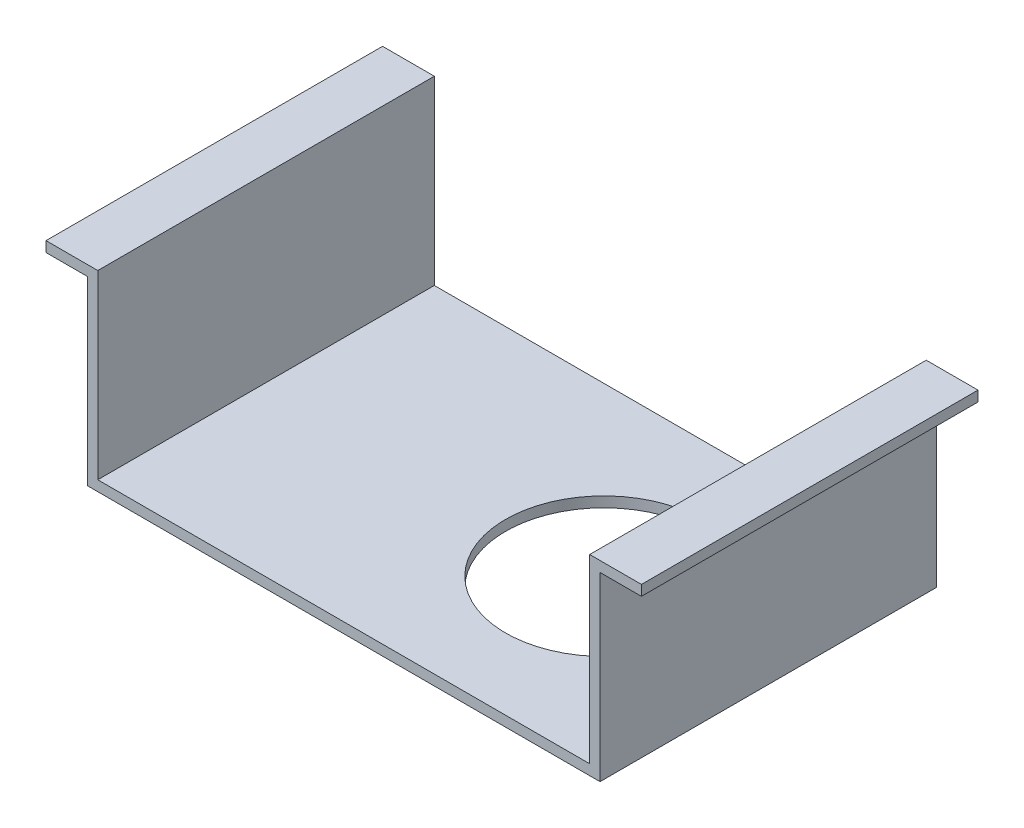
ISO-10303-21;
HEADER;
FILE_DESCRIPTION(('STEP AP214'),'2;1');
FILE_NAME('part.step','',(''),(''),'','','');
FILE_SCHEMA(('AUTOMOTIVE_DESIGN { 1 0 10303 214 1 1 1 1 }'));
ENDSEC;
DATA;
#1=APPLICATION_CONTEXT('core data for automotive mechanical design processes');
#2=APPLICATION_PROTOCOL_DEFINITION('international standard','automotive_design',2000,#1);
#3=PRODUCT_CONTEXT('',#1,'mechanical');
#4=PRODUCT('Part','Part','',(#3));
#5=PRODUCT_RELATED_PRODUCT_CATEGORY('part','',(#4));
#6=PRODUCT_DEFINITION_FORMATION('','',#4);
#7=PRODUCT_DEFINITION_CONTEXT('part definition',#1,'design');
#8=PRODUCT_DEFINITION('design','',#6,#7);
#9=PRODUCT_DEFINITION_SHAPE('','',#8);
#10=(LENGTH_UNIT() NAMED_UNIT(*) SI_UNIT(.MILLI.,.METRE.));
#11=(NAMED_UNIT(*) PLANE_ANGLE_UNIT() SI_UNIT($,.RADIAN.));
#12=(NAMED_UNIT(*) SI_UNIT($,.STERADIAN.) SOLID_ANGLE_UNIT());
#13=UNCERTAINTY_MEASURE_WITH_UNIT(LENGTH_MEASURE(1.E-05),#10,'distance_accuracy_value','');
#14=(GEOMETRIC_REPRESENTATION_CONTEXT(3) GLOBAL_UNCERTAINTY_ASSIGNED_CONTEXT((#13)) GLOBAL_UNIT_ASSIGNED_CONTEXT((#10,
#11,#12)) REPRESENTATION_CONTEXT('',''));
#15=CARTESIAN_POINT('',(0.,0.,0.));
#16=DIRECTION('',(0.,0.,1.));
#17=DIRECTION('',(1.,0.,0.));
#18=AXIS2_PLACEMENT_3D('',#15,#16,#17);
#19=CARTESIAN_POINT('',(-15.2277653266255,4.01234176298843,65.));
#20=DIRECTION('',(1.,0.,0.));
#21=DIRECTION('',(0.,0.,-1.));
#22=AXIS2_PLACEMENT_3D('',#19,#20,#21);
#23=PLANE('',#22);
#24=DIRECTION('',(0.,-1.,0.));
#25=VECTOR('',#24,1.);
#26=CARTESIAN_POINT('',(-15.2277653266255,4.01234176298843,0.));
#27=LINE('',#26,#25);
#28=CARTESIAN_POINT('',(-15.2277653266255,6.01234176298843,0.));
#29=VERTEX_POINT('',#28);
#30=CARTESIAN_POINT('',(-15.2277653266255,4.01234176298843,0.));
#31=VERTEX_POINT('',#30);
#32=EDGE_CURVE('E154',#29,#31,#27,.T.);
#33=ORIENTED_EDGE('',*,*,#32,.T.);
#34=DIRECTION('',(0.,0.,-1.));
#35=VECTOR('',#34,1.);
#36=CARTESIAN_POINT('',(-15.2277653266255,4.01234176298843,65.));
#37=LINE('',#36,#35);
#38=CARTESIAN_POINT('',(-15.2277653266255,4.01234176298843,65.));
#39=VERTEX_POINT('',#38);
#40=EDGE_CURVE('E11',#39,#31,#37,.T.);
#41=ORIENTED_EDGE('',*,*,#40,.F.);
#42=DIRECTION('',(0.,-1.,0.));
#43=VECTOR('',#42,1.);
#44=CARTESIAN_POINT('',(-15.2277653266255,4.01234176298843,65.));
#45=LINE('',#44,#43);
#46=CARTESIAN_POINT('',(-15.2277653266255,6.01234176298843,65.));
#47=VERTEX_POINT('',#46);
#48=EDGE_CURVE('E176',#47,#39,#45,.T.);
#49=ORIENTED_EDGE('',*,*,#48,.F.);
#50=DIRECTION('',(0.,0.,-1.));
#51=VECTOR('',#50,1.);
#52=CARTESIAN_POINT('',(-15.2277653266255,6.01234176298843,65.));
#53=LINE('',#52,#51);
#54=EDGE_CURVE('E150',#47,#29,#53,.T.);
#55=ORIENTED_EDGE('',*,*,#54,.T.);
#56=EDGE_LOOP('',(#33,#41,#49,#55));
#57=FACE_BOUND('',#56,.T.);
#58=ADVANCED_FACE('F33',(#57),#23,.F.);
#59=CARTESIAN_POINT('',(-7.2277653266255,4.01234176298844,65.));
#60=DIRECTION('',(0.,1.,0.));
#61=DIRECTION('',(-1.,0.,0.));
#62=AXIS2_PLACEMENT_3D('',#59,#60,#61);
#63=PLANE('',#62);
#64=DIRECTION('',(1.,0.,0.));
#65=VECTOR('',#64,1.);
#66=CARTESIAN_POINT('',(-7.2277653266255,4.01234176298844,0.));
#67=LINE('',#66,#65);
#68=CARTESIAN_POINT('',(-7.2277653266255,4.01234176298844,0.));
#69=VERTEX_POINT('',#68);
#70=EDGE_CURVE('E157',#31,#69,#67,.T.);
#71=ORIENTED_EDGE('',*,*,#70,.T.);
#72=DIRECTION('',(0.,0.,-1.));
#73=VECTOR('',#72,1.);
#74=CARTESIAN_POINT('',(-7.2277653266255,4.01234176298844,65.));
#75=LINE('',#74,#73);
#76=CARTESIAN_POINT('',(-7.2277653266255,4.01234176298844,65.));
#77=VERTEX_POINT('',#76);
#78=EDGE_CURVE('E42',#77,#69,#75,.T.);
#79=ORIENTED_EDGE('',*,*,#78,.F.);
#80=DIRECTION('',(1.,0.,0.));
#81=VECTOR('',#80,1.);
#82=CARTESIAN_POINT('',(-7.2277653266255,4.01234176298844,65.));
#83=LINE('',#82,#81);
#84=EDGE_CURVE('E105',#39,#77,#83,.T.);
#85=ORIENTED_EDGE('',*,*,#84,.F.);
#86=ORIENTED_EDGE('',*,*,#40,.T.);
#87=EDGE_LOOP('',(#71,#79,#85,#86));
#88=FACE_BOUND('',#87,.T.);
#89=ADVANCED_FACE('F255',(#88),#63,.F.);
#90=CARTESIAN_POINT('',(-7.2277653266255,-30.9876582370116,65.));
#91=DIRECTION('',(1.,0.,0.));
#92=DIRECTION('',(0.,1.,0.));
#93=AXIS2_PLACEMENT_3D('',#90,#91,#92);
#94=PLANE('',#93);
#95=DIRECTION('',(0.,-1.,0.));
#96=VECTOR('',#95,1.);
#97=CARTESIAN_POINT('',(-7.2277653266255,-30.9876582370116,0.));
#98=LINE('',#97,#96);
#99=CARTESIAN_POINT('',(-7.2277653266255,-30.9876582370116,0.));
#100=VERTEX_POINT('',#99);
#101=EDGE_CURVE('E159',#69,#100,#98,.T.);
#102=ORIENTED_EDGE('',*,*,#101,.T.);
#103=DIRECTION('',(0.,0.,-1.));
#104=VECTOR('',#103,1.);
#105=CARTESIAN_POINT('',(-7.2277653266255,-30.9876582370116,65.));
#106=LINE('',#105,#104);
#107=CARTESIAN_POINT('',(-7.2277653266255,-30.9876582370116,65.));
#108=VERTEX_POINT('',#107);
#109=EDGE_CURVE('E195',#108,#100,#106,.T.);
#110=ORIENTED_EDGE('',*,*,#109,.F.);
#111=DIRECTION('',(0.,-1.,0.));
#112=VECTOR('',#111,1.);
#113=CARTESIAN_POINT('',(-7.2277653266255,-30.9876582370116,65.));
#114=LINE('',#113,#112);
#115=EDGE_CURVE('E204',#77,#108,#114,.T.);
#116=ORIENTED_EDGE('',*,*,#115,.F.);
#117=ORIENTED_EDGE('',*,*,#78,.T.);
#118=EDGE_LOOP('',(#102,#110,#116,#117));
#119=FACE_BOUND('',#118,.T.);
#120=ADVANCED_FACE('F202',(#119),#94,.F.);
#121=CARTESIAN_POINT('',(91.7722346733745,-30.9876582370116,65.));
#122=DIRECTION('',(0.,1.,0.));
#123=DIRECTION('',(-1.,0.,0.));
#124=AXIS2_PLACEMENT_3D('',#121,#122,#123);
#125=PLANE('',#124);
#126=CARTESIAN_POINT('',(59.7722346733745,-30.9876582370116,32.2530530155588));
#127=DIRECTION('',(0.,-1.,0.));
#128=DIRECTION('',(1.,0.,0.));
#129=AXIS2_PLACEMENT_3D('',#126,#127,#128);
#130=CIRCLE('',#129,19.);
#131=CARTESIAN_POINT('',(78.7722346733745,-30.9876582370116,32.2530530155588));
#132=VERTEX_POINT('',#131);
#133=EDGE_CURVE('E288',#132,#132,#130,.T.);
#134=ORIENTED_EDGE('',*,*,#133,.F.);
#135=EDGE_LOOP('',(#134));
#136=FACE_BOUND('',#135,.T.);
#137=DIRECTION('',(1.,0.,0.));
#138=VECTOR('',#137,1.);
#139=CARTESIAN_POINT('',(91.7722346733745,-30.9876582370116,0.));
#140=LINE('',#139,#138);
#141=CARTESIAN_POINT('',(91.7722346733745,-30.9876582370116,0.));
#142=VERTEX_POINT('',#141);
#143=EDGE_CURVE('E161',#100,#142,#140,.T.);
#144=ORIENTED_EDGE('',*,*,#143,.T.);
#145=DIRECTION('',(0.,0.,-1.));
#146=VECTOR('',#145,1.);
#147=CARTESIAN_POINT('',(91.7722346733745,-30.9876582370116,65.));
#148=LINE('',#147,#146);
#149=CARTESIAN_POINT('',(91.7722346733745,-30.9876582370116,65.));
#150=VERTEX_POINT('',#149);
#151=EDGE_CURVE('E192',#150,#142,#148,.T.);
#152=ORIENTED_EDGE('',*,*,#151,.F.);
#153=DIRECTION('',(1.,0.,0.));
#154=VECTOR('',#153,1.);
#155=CARTESIAN_POINT('',(91.7722346733745,-30.9876582370116,65.));
#156=LINE('',#155,#154);
#157=EDGE_CURVE('E222',#108,#150,#156,.T.);
#158=ORIENTED_EDGE('',*,*,#157,.F.);
#159=ORIENTED_EDGE('',*,*,#109,.T.);
#160=EDGE_LOOP('',(#144,#152,#158,#159));
#161=FACE_BOUND('',#160,.T.);
#162=ADVANCED_FACE('F213',(#136,#161),#125,.F.);
#163=CARTESIAN_POINT('',(91.7722346733745,4.01234176298843,65.));
#164=DIRECTION('',(-1.,0.,0.));
#165=DIRECTION('',(0.,0.,1.));
#166=AXIS2_PLACEMENT_3D('',#163,#164,#165);
#167=PLANE('',#166);
#168=DIRECTION('',(0.,1.,0.));
#169=VECTOR('',#168,1.);
#170=CARTESIAN_POINT('',(91.7722346733745,4.01234176298843,0.));
#171=LINE('',#170,#169);
#172=CARTESIAN_POINT('',(91.7722346733745,4.01234176298843,0.));
#173=VERTEX_POINT('',#172);
#174=EDGE_CURVE('E163',#142,#173,#171,.T.);
#175=ORIENTED_EDGE('',*,*,#174,.T.);
#176=DIRECTION('',(0.,0.,-1.));
#177=VECTOR('',#176,1.);
#178=CARTESIAN_POINT('',(91.7722346733745,4.01234176298843,65.));
#179=LINE('',#178,#177);
#180=CARTESIAN_POINT('',(91.7722346733745,4.01234176298843,65.));
#181=VERTEX_POINT('',#180);
#182=EDGE_CURVE('E189',#181,#173,#179,.T.);
#183=ORIENTED_EDGE('',*,*,#182,.F.);
#184=DIRECTION('',(0.,1.,0.));
#185=VECTOR('',#184,1.);
#186=CARTESIAN_POINT('',(91.7722346733745,4.01234176298843,65.));
#187=LINE('',#186,#185);
#188=EDGE_CURVE('E219',#150,#181,#187,.T.);
#189=ORIENTED_EDGE('',*,*,#188,.F.);
#190=ORIENTED_EDGE('',*,*,#151,.T.);
#191=EDGE_LOOP('',(#175,#183,#189,#190));
#192=FACE_BOUND('',#191,.T.);
#193=ADVANCED_FACE('F217',(#192),#167,.F.);
#194=CARTESIAN_POINT('',(99.7722346733745,4.01234176298843,65.));
#195=DIRECTION('',(0.,1.,0.));
#196=DIRECTION('',(-1.,0.,0.));
#197=AXIS2_PLACEMENT_3D('',#194,#195,#196);
#198=PLANE('',#197);
#199=DIRECTION('',(1.,0.,0.));
#200=VECTOR('',#199,1.);
#201=CARTESIAN_POINT('',(99.7722346733745,4.01234176298843,0.));
#202=LINE('',#201,#200);
#203=CARTESIAN_POINT('',(99.7722346733745,4.01234176298843,0.));
#204=VERTEX_POINT('',#203);
#205=EDGE_CURVE('E165',#173,#204,#202,.T.);
#206=ORIENTED_EDGE('',*,*,#205,.T.);
#207=DIRECTION('',(0.,0.,-1.));
#208=VECTOR('',#207,1.);
#209=CARTESIAN_POINT('',(99.7722346733745,4.01234176298843,65.));
#210=LINE('',#209,#208);
#211=CARTESIAN_POINT('',(99.7722346733745,4.01234176298843,65.));
#212=VERTEX_POINT('',#211);
#213=EDGE_CURVE('E186',#212,#204,#210,.T.);
#214=ORIENTED_EDGE('',*,*,#213,.F.);
#215=DIRECTION('',(1.,0.,0.));
#216=VECTOR('',#215,1.);
#217=CARTESIAN_POINT('',(99.7722346733745,4.01234176298843,65.));
#218=LINE('',#217,#216);
#219=EDGE_CURVE('E221',#181,#212,#218,.T.);
#220=ORIENTED_EDGE('',*,*,#219,.F.);
#221=ORIENTED_EDGE('',*,*,#182,.T.);
#222=EDGE_LOOP('',(#206,#214,#220,#221));
#223=FACE_BOUND('',#222,.T.);
#224=ADVANCED_FACE('F269',(#223),#198,.F.);
#225=CARTESIAN_POINT('',(99.7722346733745,6.01234176298843,65.));
#226=DIRECTION('',(-1.,0.,0.));
#227=DIRECTION('',(0.,0.,1.));
#228=AXIS2_PLACEMENT_3D('',#225,#226,#227);
#229=PLANE('',#228);
#230=DIRECTION('',(0.,1.,0.));
#231=VECTOR('',#230,1.);
#232=CARTESIAN_POINT('',(99.7722346733745,6.01234176298843,0.));
#233=LINE('',#232,#231);
#234=CARTESIAN_POINT('',(99.7722346733745,6.01234176298843,0.));
#235=VERTEX_POINT('',#234);
#236=EDGE_CURVE('E167',#204,#235,#233,.T.);
#237=ORIENTED_EDGE('',*,*,#236,.T.);
#238=DIRECTION('',(0.,0.,-1.));
#239=VECTOR('',#238,1.);
#240=CARTESIAN_POINT('',(99.7722346733745,6.01234176298843,65.));
#241=LINE('',#240,#239);
#242=CARTESIAN_POINT('',(99.7722346733745,6.01234176298843,65.));
#243=VERTEX_POINT('',#242);
#244=EDGE_CURVE('E183',#243,#235,#241,.T.);
#245=ORIENTED_EDGE('',*,*,#244,.F.);
#246=DIRECTION('',(0.,1.,0.));
#247=VECTOR('',#246,1.);
#248=CARTESIAN_POINT('',(99.7722346733745,6.01234176298843,65.));
#249=LINE('',#248,#247);
#250=EDGE_CURVE('E224',#212,#243,#249,.T.);
#251=ORIENTED_EDGE('',*,*,#250,.F.);
#252=ORIENTED_EDGE('',*,*,#213,.T.);
#253=EDGE_LOOP('',(#237,#245,#251,#252));
#254=FACE_BOUND('',#253,.T.);
#255=ADVANCED_FACE('F272',(#254),#229,.F.);
#256=CARTESIAN_POINT('',(89.7722346733745,6.01234176298843,65.));
#257=DIRECTION('',(0.,-1.,0.));
#258=DIRECTION('',(0.,0.,-1.));
#259=AXIS2_PLACEMENT_3D('',#256,#257,#258);
#260=PLANE('',#259);
#261=DIRECTION('',(-1.,0.,0.));
#262=VECTOR('',#261,1.);
#263=CARTESIAN_POINT('',(89.7722346733745,6.01234176298843,0.));
#264=LINE('',#263,#262);
#265=CARTESIAN_POINT('',(89.7722346733745,6.01234176298843,0.));
#266=VERTEX_POINT('',#265);
#267=EDGE_CURVE('E169',#235,#266,#264,.T.);
#268=ORIENTED_EDGE('',*,*,#267,.T.);
#269=DIRECTION('',(0.,0.,-1.));
#270=VECTOR('',#269,1.);
#271=CARTESIAN_POINT('',(89.7722346733745,6.01234176298843,65.));
#272=LINE('',#271,#270);
#273=CARTESIAN_POINT('',(89.7722346733745,6.01234176298843,65.));
#274=VERTEX_POINT('',#273);
#275=EDGE_CURVE('E180',#274,#266,#272,.T.);
#276=ORIENTED_EDGE('',*,*,#275,.F.);
#277=DIRECTION('',(-1.,0.,0.));
#278=VECTOR('',#277,1.);
#279=CARTESIAN_POINT('',(89.7722346733745,6.01234176298843,65.));
#280=LINE('',#279,#278);
#281=EDGE_CURVE('E230',#243,#274,#280,.T.);
#282=ORIENTED_EDGE('',*,*,#281,.F.);
#283=ORIENTED_EDGE('',*,*,#244,.T.);
#284=EDGE_LOOP('',(#268,#276,#282,#283));
#285=FACE_BOUND('',#284,.T.);
#286=ADVANCED_FACE('F236',(#285),#260,.F.);
#287=CARTESIAN_POINT('',(89.7722346733745,-28.9876582370116,65.));
#288=DIRECTION('',(1.,0.,0.));
#289=DIRECTION('',(0.,0.,-1.));
#290=AXIS2_PLACEMENT_3D('',#287,#288,#289);
#291=PLANE('',#290);
#292=DIRECTION('',(0.,-1.,0.));
#293=VECTOR('',#292,1.);
#294=CARTESIAN_POINT('',(89.7722346733745,-28.9876582370116,0.));
#295=LINE('',#294,#293);
#296=CARTESIAN_POINT('',(89.7722346733745,-28.9876582370116,0.));
#297=VERTEX_POINT('',#296);
#298=EDGE_CURVE('E171',#266,#297,#295,.T.);
#299=ORIENTED_EDGE('',*,*,#298,.T.);
#300=DIRECTION('',(0.,0.,-1.));
#301=VECTOR('',#300,1.);
#302=CARTESIAN_POINT('',(89.7722346733745,-28.9876582370116,65.));
#303=LINE('',#302,#301);
#304=CARTESIAN_POINT('',(89.7722346733745,-28.9876582370116,65.));
#305=VERTEX_POINT('',#304);
#306=EDGE_CURVE('E145',#305,#297,#303,.T.);
#307=ORIENTED_EDGE('',*,*,#306,.F.);
#308=DIRECTION('',(0.,-1.,0.));
#309=VECTOR('',#308,1.);
#310=CARTESIAN_POINT('',(89.7722346733745,-28.9876582370116,65.));
#311=LINE('',#310,#309);
#312=EDGE_CURVE('E136',#274,#305,#311,.T.);
#313=ORIENTED_EDGE('',*,*,#312,.F.);
#314=ORIENTED_EDGE('',*,*,#275,.T.);
#315=EDGE_LOOP('',(#299,#307,#313,#314));
#316=FACE_BOUND('',#315,.T.);
#317=ADVANCED_FACE('F240',(#316),#291,.F.);
#318=CARTESIAN_POINT('',(-5.22776532662549,-28.9876582370116,65.));
#319=DIRECTION('',(0.,-1.,0.));
#320=DIRECTION('',(0.,0.,-1.));
#321=AXIS2_PLACEMENT_3D('',#318,#319,#320);
#322=PLANE('',#321);
#323=CARTESIAN_POINT('',(59.7722346733745,-28.9876582370116,32.2530530155588));
#324=DIRECTION('',(0.,-1.,0.));
#325=DIRECTION('',(0.,0.,-1.));
#326=AXIS2_PLACEMENT_3D('',#323,#324,#325);
#327=CIRCLE('',#326,19.);
#328=CARTESIAN_POINT('',(59.7722346733745,-28.9876582370116,13.2530530155588));
#329=VERTEX_POINT('',#328);
#330=EDGE_CURVE('E36',#329,#329,#327,.T.);
#331=ORIENTED_EDGE('',*,*,#330,.T.);
#332=EDGE_LOOP('',(#331));
#333=FACE_BOUND('',#332,.T.);
#334=DIRECTION('',(-1.,0.,0.));
#335=VECTOR('',#334,1.);
#336=CARTESIAN_POINT('',(-5.22776532662549,-28.9876582370116,0.));
#337=LINE('',#336,#335);
#338=CARTESIAN_POINT('',(-5.22776532662549,-28.9876582370116,0.));
#339=VERTEX_POINT('',#338);
#340=EDGE_CURVE('E144',#297,#339,#337,.T.);
#341=ORIENTED_EDGE('',*,*,#340,.T.);
#342=DIRECTION('',(0.,0.,-1.));
#343=VECTOR('',#342,1.);
#344=CARTESIAN_POINT('',(-5.22776532662549,-28.9876582370116,65.));
#345=LINE('',#344,#343);
#346=CARTESIAN_POINT('',(-5.22776532662549,-28.9876582370116,65.));
#347=VERTEX_POINT('',#346);
#348=EDGE_CURVE('E141',#347,#339,#345,.T.);
#349=ORIENTED_EDGE('',*,*,#348,.F.);
#350=DIRECTION('',(-1.,0.,0.));
#351=VECTOR('',#350,1.);
#352=CARTESIAN_POINT('',(-5.22776532662549,-28.9876582370116,65.));
#353=LINE('',#352,#351);
#354=EDGE_CURVE('E130',#305,#347,#353,.T.);
#355=ORIENTED_EDGE('',*,*,#354,.F.);
#356=ORIENTED_EDGE('',*,*,#306,.T.);
#357=EDGE_LOOP('',(#341,#349,#355,#356));
#358=FACE_BOUND('',#357,.T.);
#359=ADVANCED_FACE('F142',(#333,#358),#322,.F.);
#360=CARTESIAN_POINT('',(-5.2277653266255,6.01234176298843,65.));
#361=DIRECTION('',(-1.,0.,0.));
#362=DIRECTION('',(0.,-1.,0.));
#363=AXIS2_PLACEMENT_3D('',#360,#361,#362);
#364=PLANE('',#363);
#365=DIRECTION('',(0.,1.,0.));
#366=VECTOR('',#365,1.);
#367=CARTESIAN_POINT('',(-5.2277653266255,6.01234176298843,0.));
#368=LINE('',#367,#366);
#369=CARTESIAN_POINT('',(-5.2277653266255,6.01234176298843,0.));
#370=VERTEX_POINT('',#369);
#371=EDGE_CURVE('E91',#339,#370,#368,.T.);
#372=ORIENTED_EDGE('',*,*,#371,.T.);
#373=DIRECTION('',(0.,0.,-1.));
#374=VECTOR('',#373,1.);
#375=CARTESIAN_POINT('',(-5.2277653266255,6.01234176298843,65.));
#376=LINE('',#375,#374);
#377=CARTESIAN_POINT('',(-5.2277653266255,6.01234176298843,65.));
#378=VERTEX_POINT('',#377);
#379=EDGE_CURVE('E146',#378,#370,#376,.T.);
#380=ORIENTED_EDGE('',*,*,#379,.F.);
#381=DIRECTION('',(0.,1.,0.));
#382=VECTOR('',#381,1.);
#383=CARTESIAN_POINT('',(-5.2277653266255,6.01234176298843,65.));
#384=LINE('',#383,#382);
#385=EDGE_CURVE('E134',#347,#378,#384,.T.);
#386=ORIENTED_EDGE('',*,*,#385,.F.);
#387=ORIENTED_EDGE('',*,*,#348,.T.);
#388=EDGE_LOOP('',(#372,#380,#386,#387));
#389=FACE_BOUND('',#388,.T.);
#390=ADVANCED_FACE('F148',(#389),#364,.F.);
#391=CARTESIAN_POINT('',(-15.2277653266255,6.01234176298843,65.));
#392=DIRECTION('',(0.,-1.,0.));
#393=DIRECTION('',(0.,0.,-1.));
#394=AXIS2_PLACEMENT_3D('',#391,#392,#393);
#395=PLANE('',#394);
#396=DIRECTION('',(-1.,0.,0.));
#397=VECTOR('',#396,1.);
#398=CARTESIAN_POINT('',(-15.2277653266255,6.01234176298843,0.));
#399=LINE('',#398,#397);
#400=EDGE_CURVE('E97',#370,#29,#399,.T.);
#401=ORIENTED_EDGE('',*,*,#400,.T.);
#402=ORIENTED_EDGE('',*,*,#54,.F.);
#403=DIRECTION('',(-1.,0.,0.));
#404=VECTOR('',#403,1.);
#405=CARTESIAN_POINT('',(-15.2277653266255,6.01234176298843,65.));
#406=LINE('',#405,#404);
#407=EDGE_CURVE('E50',#378,#47,#406,.T.);
#408=ORIENTED_EDGE('',*,*,#407,.F.);
#409=ORIENTED_EDGE('',*,*,#379,.T.);
#410=EDGE_LOOP('',(#401,#402,#408,#409));
#411=FACE_BOUND('',#410,.T.);
#412=ADVANCED_FACE('F244',(#411),#395,.F.);
#413=CARTESIAN_POINT('',(0.,0.,65.));
#414=DIRECTION('',(0.,0.,-1.));
#415=DIRECTION('',(-1.,0.,0.));
#416=AXIS2_PLACEMENT_3D('',#413,#414,#415);
#417=PLANE('',#416);
#418=ORIENTED_EDGE('',*,*,#48,.T.);
#419=ORIENTED_EDGE('',*,*,#84,.T.);
#420=ORIENTED_EDGE('',*,*,#115,.T.);
#421=ORIENTED_EDGE('',*,*,#157,.T.);
#422=ORIENTED_EDGE('',*,*,#188,.T.);
#423=ORIENTED_EDGE('',*,*,#219,.T.);
#424=ORIENTED_EDGE('',*,*,#250,.T.);
#425=ORIENTED_EDGE('',*,*,#281,.T.);
#426=ORIENTED_EDGE('',*,*,#312,.T.);
#427=ORIENTED_EDGE('',*,*,#354,.T.);
#428=ORIENTED_EDGE('',*,*,#385,.T.);
#429=ORIENTED_EDGE('',*,*,#407,.T.);
#430=EDGE_LOOP('',(#418,#419,#420,#421,#422,#423,#424,#425,#426,#427,#428,#429));
#431=FACE_BOUND('',#430,.T.);
#432=ADVANCED_FACE('F132',(#431),#417,.F.);
#433=CARTESIAN_POINT('',(0.,0.,0.));
#434=DIRECTION('',(0.,0.,-1.));
#435=DIRECTION('',(-1.,0.,0.));
#436=AXIS2_PLACEMENT_3D('',#433,#434,#435);
#437=PLANE('',#436);
#438=ORIENTED_EDGE('',*,*,#32,.F.);
#439=ORIENTED_EDGE('',*,*,#400,.F.);
#440=ORIENTED_EDGE('',*,*,#371,.F.);
#441=ORIENTED_EDGE('',*,*,#340,.F.);
#442=ORIENTED_EDGE('',*,*,#298,.F.);
#443=ORIENTED_EDGE('',*,*,#267,.F.);
#444=ORIENTED_EDGE('',*,*,#236,.F.);
#445=ORIENTED_EDGE('',*,*,#205,.F.);
#446=ORIENTED_EDGE('',*,*,#174,.F.);
#447=ORIENTED_EDGE('',*,*,#143,.F.);
#448=ORIENTED_EDGE('',*,*,#101,.F.);
#449=ORIENTED_EDGE('',*,*,#70,.F.);
#450=EDGE_LOOP('',(#438,#439,#440,#441,#442,#443,#444,#445,#446,#447,#448,#449));
#451=FACE_BOUND('',#450,.T.);
#452=ADVANCED_FACE('F208',(#451),#437,.T.);
#453=CARTESIAN_POINT('',(59.7722346733745,6.01234176298845,32.2530530155588));
#454=DIRECTION('',(0.,-1.,0.));
#455=DIRECTION('',(1.,0.,0.));
#456=AXIS2_PLACEMENT_3D('',#453,#454,#455);
#457=CYLINDRICAL_SURFACE('',#456,19.);
#458=ORIENTED_EDGE('',*,*,#133,.T.);
#459=EDGE_LOOP('',(#458));
#460=FACE_BOUND('',#459,.T.);
#461=ORIENTED_EDGE('',*,*,#330,.F.);
#462=EDGE_LOOP('',(#461));
#463=FACE_BOUND('',#462,.T.);
#464=ADVANCED_FACE('F295',(#460,#463),#457,.F.);
#465=CLOSED_SHELL('',(#58,#89,#120,#162,#193,#224,#255,#286,#317,#359,#390,#412,#432,#452,#464));
#466=MANIFOLD_SOLID_BREP('B2',#465);
#467=ADVANCED_BREP_SHAPE_REPRESENTATION('',(#18,#466),#14);
#468=SHAPE_DEFINITION_REPRESENTATION(#9,#467);
ENDSEC;
END-ISO-10303-21;
